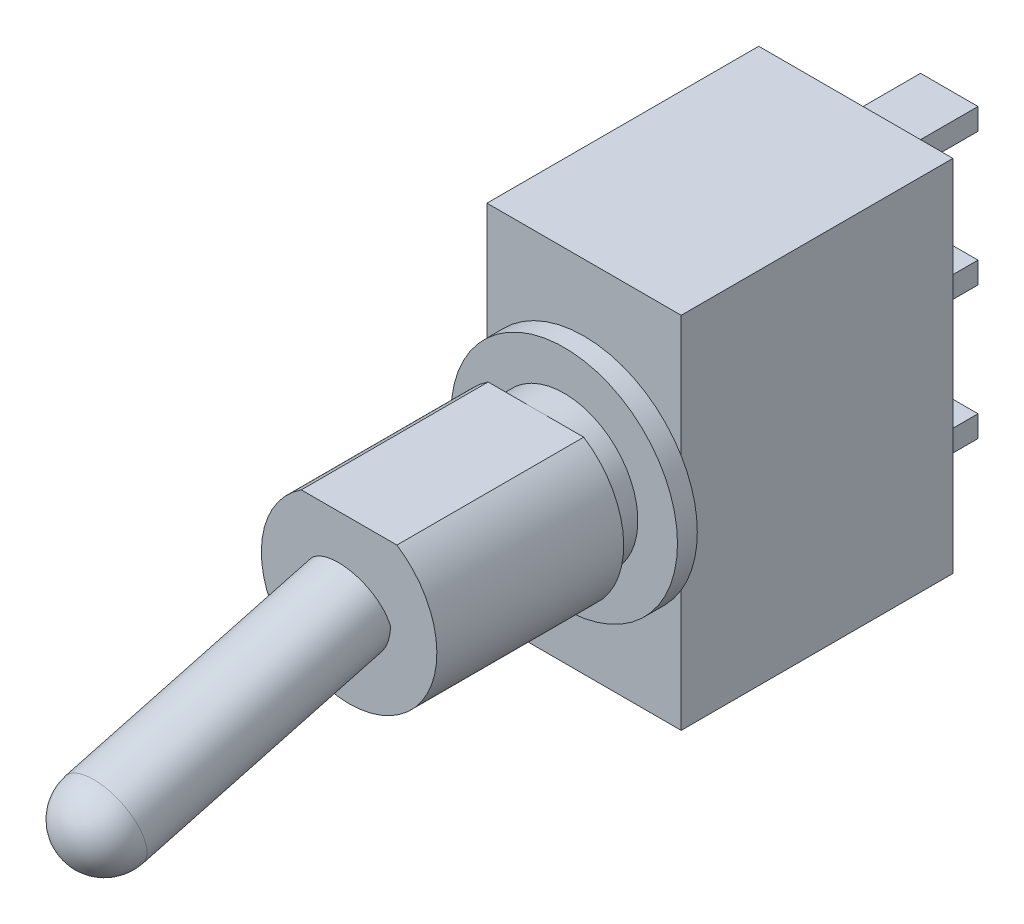
ISO-10303-21;
HEADER;
FILE_DESCRIPTION(('STEP AP214'),'2;1');
FILE_NAME('part.step','',(''),(''),'','','');
FILE_SCHEMA(('AUTOMOTIVE_DESIGN { 1 0 10303 214 1 1 1 1 }'));
ENDSEC;
DATA;
#1=APPLICATION_CONTEXT('core data for automotive mechanical design processes');
#2=APPLICATION_PROTOCOL_DEFINITION('international standard','automotive_design',2000,#1);
#3=PRODUCT_CONTEXT('',#1,'mechanical');
#4=PRODUCT('Part','Part','',(#3));
#5=PRODUCT_RELATED_PRODUCT_CATEGORY('part','',(#4));
#6=PRODUCT_DEFINITION_FORMATION('','',#4);
#7=PRODUCT_DEFINITION_CONTEXT('part definition',#1,'design');
#8=PRODUCT_DEFINITION('design','',#6,#7);
#9=PRODUCT_DEFINITION_SHAPE('','',#8);
#10=(LENGTH_UNIT() NAMED_UNIT(*) SI_UNIT(.MILLI.,.METRE.));
#11=(NAMED_UNIT(*) PLANE_ANGLE_UNIT() SI_UNIT($,.RADIAN.));
#12=(NAMED_UNIT(*) SI_UNIT($,.STERADIAN.) SOLID_ANGLE_UNIT());
#13=UNCERTAINTY_MEASURE_WITH_UNIT(LENGTH_MEASURE(1.E-05),#10,'distance_accuracy_value','');
#14=(GEOMETRIC_REPRESENTATION_CONTEXT(3) GLOBAL_UNCERTAINTY_ASSIGNED_CONTEXT((#13)) GLOBAL_UNIT_ASSIGNED_CONTEXT((#10,
#11,#12)) REPRESENTATION_CONTEXT('',''));
#15=CARTESIAN_POINT('',(0.,0.,0.));
#16=DIRECTION('',(0.,0.,1.));
#17=DIRECTION('',(1.,0.,0.));
#18=AXIS2_PLACEMENT_3D('',#15,#16,#17);
#19=CARTESIAN_POINT('',(0.,0.,9.6));
#20=DIRECTION('',(0.,0.,1.));
#21=DIRECTION('',(1.,0.,0.));
#22=AXIS2_PLACEMENT_3D('',#19,#20,#21);
#23=PLANE('',#22);
#24=DIRECTION('',(0.,-1.,0.));
#25=VECTOR('',#24,1.);
#26=CARTESIAN_POINT('',(-3.43,6.35,9.6));
#27=LINE('',#26,#25);
#28=CARTESIAN_POINT('',(-3.43,6.35,9.6));
#29=VERTEX_POINT('',#28);
#30=CARTESIAN_POINT('',(-3.43,2.05793585905878,9.6));
#31=VERTEX_POINT('',#30);
#32=EDGE_CURVE('E225',#29,#31,#27,.T.);
#33=ORIENTED_EDGE('',*,*,#32,.T.);
#34=CARTESIAN_POINT('',(0.,0.,9.6));
#35=DIRECTION('',(0.,0.,-1.));
#36=DIRECTION('',(-1.,0.,0.));
#37=AXIS2_PLACEMENT_3D('',#34,#35,#36);
#38=CIRCLE('',#37,4.);
#39=CARTESIAN_POINT('',(3.43,2.05793585905878,9.6));
#40=VERTEX_POINT('',#39);
#41=EDGE_CURVE('E212',#31,#40,#38,.T.);
#42=ORIENTED_EDGE('',*,*,#41,.T.);
#43=DIRECTION('',(0.,1.,0.));
#44=VECTOR('',#43,1.);
#45=CARTESIAN_POINT('',(3.43,6.35,9.6));
#46=LINE('',#45,#44);
#47=CARTESIAN_POINT('',(3.43,6.35,9.6));
#48=VERTEX_POINT('',#47);
#49=EDGE_CURVE('E222',#40,#48,#46,.T.);
#50=ORIENTED_EDGE('',*,*,#49,.T.);
#51=DIRECTION('',(-1.,0.,0.));
#52=VECTOR('',#51,1.);
#53=CARTESIAN_POINT('',(-3.43,6.35,9.6));
#54=LINE('',#53,#52);
#55=EDGE_CURVE('E220',#48,#29,#54,.T.);
#56=ORIENTED_EDGE('',*,*,#55,.T.);
#57=EDGE_LOOP('',(#33,#42,#50,#56));
#58=FACE_BOUND('',#57,.T.);
#59=ADVANCED_FACE('F34',(#58),#23,.T.);
#60=CARTESIAN_POINT('',(3.43,6.35,9.6));
#61=DIRECTION('',(-1.,0.,0.));
#62=DIRECTION('',(0.,-1.,0.));
#63=AXIS2_PLACEMENT_3D('',#60,#61,#62);
#64=PLANE('',#63);
#65=DIRECTION('',(0.,1.,0.));
#66=VECTOR('',#65,1.);
#67=CARTESIAN_POINT('',(3.43,6.35,0.));
#68=LINE('',#67,#66);
#69=CARTESIAN_POINT('',(3.43,-6.35,0.));
#70=VERTEX_POINT('',#69);
#71=CARTESIAN_POINT('',(3.43,6.35,0.));
#72=VERTEX_POINT('',#71);
#73=EDGE_CURVE('E211',#70,#72,#68,.T.);
#74=ORIENTED_EDGE('',*,*,#73,.T.);
#75=DIRECTION('',(0.,0.,-1.));
#76=VECTOR('',#75,1.);
#77=CARTESIAN_POINT('',(3.43,6.35,9.6));
#78=LINE('',#77,#76);
#79=EDGE_CURVE('E248',#48,#72,#78,.T.);
#80=ORIENTED_EDGE('',*,*,#79,.F.);
#81=ORIENTED_EDGE('',*,*,#49,.F.);
#82=CARTESIAN_POINT('',(3.43,-2.05793585905878,9.6));
#83=VERTEX_POINT('',#82);
#84=EDGE_CURVE('E221',#83,#40,#46,.T.);
#85=ORIENTED_EDGE('',*,*,#84,.F.);
#86=CARTESIAN_POINT('',(3.43,-6.35,9.6));
#87=VERTEX_POINT('',#86);
#88=EDGE_CURVE('E217',#87,#83,#46,.T.);
#89=ORIENTED_EDGE('',*,*,#88,.F.);
#90=DIRECTION('',(0.,0.,-1.));
#91=VECTOR('',#90,1.);
#92=CARTESIAN_POINT('',(3.43,-6.35,9.6));
#93=LINE('',#92,#91);
#94=EDGE_CURVE('E231',#87,#70,#93,.T.);
#95=ORIENTED_EDGE('',*,*,#94,.T.);
#96=EDGE_LOOP('',(#74,#80,#81,#85,#89,#95));
#97=FACE_BOUND('',#96,.T.);
#98=ADVANCED_FACE('F36',(#97),#64,.F.);
#99=CARTESIAN_POINT('',(-3.43,6.35,9.6));
#100=DIRECTION('',(0.,-1.,0.));
#101=DIRECTION('',(1.,0.,0.));
#102=AXIS2_PLACEMENT_3D('',#99,#100,#101);
#103=PLANE('',#102);
#104=DIRECTION('',(-1.,0.,0.));
#105=VECTOR('',#104,1.);
#106=CARTESIAN_POINT('',(-3.43,6.35,0.));
#107=LINE('',#106,#105);
#108=CARTESIAN_POINT('',(-3.43,6.35,0.));
#109=VERTEX_POINT('',#108);
#110=EDGE_CURVE('E234',#72,#109,#107,.T.);
#111=ORIENTED_EDGE('',*,*,#110,.T.);
#112=DIRECTION('',(0.,0.,-1.));
#113=VECTOR('',#112,1.);
#114=CARTESIAN_POINT('',(-3.43,6.35,9.6));
#115=LINE('',#114,#113);
#116=EDGE_CURVE('E245',#29,#109,#115,.T.);
#117=ORIENTED_EDGE('',*,*,#116,.F.);
#118=ORIENTED_EDGE('',*,*,#55,.F.);
#119=ORIENTED_EDGE('',*,*,#79,.T.);
#120=EDGE_LOOP('',(#111,#117,#118,#119));
#121=FACE_BOUND('',#120,.T.);
#122=ADVANCED_FACE('F400',(#121),#103,.F.);
#123=CARTESIAN_POINT('',(-3.43,6.35,9.6));
#124=DIRECTION('',(1.,0.,0.));
#125=DIRECTION('',(0.,1.,0.));
#126=AXIS2_PLACEMENT_3D('',#123,#124,#125);
#127=PLANE('',#126);
#128=DIRECTION('',(0.,-1.,0.));
#129=VECTOR('',#128,1.);
#130=CARTESIAN_POINT('',(-3.43,6.35,0.));
#131=LINE('',#130,#129);
#132=CARTESIAN_POINT('',(-3.43,-6.35,0.));
#133=VERTEX_POINT('',#132);
#134=EDGE_CURVE('E236',#109,#133,#131,.T.);
#135=ORIENTED_EDGE('',*,*,#134,.T.);
#136=DIRECTION('',(0.,0.,-1.));
#137=VECTOR('',#136,1.);
#138=CARTESIAN_POINT('',(-3.43,-6.35,9.6));
#139=LINE('',#138,#137);
#140=CARTESIAN_POINT('',(-3.43,-6.35,9.6));
#141=VERTEX_POINT('',#140);
#142=EDGE_CURVE('E242',#141,#133,#139,.T.);
#143=ORIENTED_EDGE('',*,*,#142,.F.);
#144=CARTESIAN_POINT('',(-3.43,-2.05793585905878,9.6));
#145=VERTEX_POINT('',#144);
#146=EDGE_CURVE('E224',#145,#141,#27,.T.);
#147=ORIENTED_EDGE('',*,*,#146,.F.);
#148=EDGE_CURVE('E229',#31,#145,#27,.T.);
#149=ORIENTED_EDGE('',*,*,#148,.F.);
#150=ORIENTED_EDGE('',*,*,#32,.F.);
#151=ORIENTED_EDGE('',*,*,#116,.T.);
#152=EDGE_LOOP('',(#135,#143,#147,#149,#150,#151));
#153=FACE_BOUND('',#152,.T.);
#154=ADVANCED_FACE('F392',(#153),#127,.F.);
#155=CARTESIAN_POINT('',(-3.43,-6.35,9.6));
#156=DIRECTION('',(0.,1.,0.));
#157=DIRECTION('',(-1.,0.,0.));
#158=AXIS2_PLACEMENT_3D('',#155,#156,#157);
#159=PLANE('',#158);
#160=DIRECTION('',(1.,0.,0.));
#161=VECTOR('',#160,1.);
#162=CARTESIAN_POINT('',(-3.43,-6.35,0.));
#163=LINE('',#162,#161);
#164=EDGE_CURVE('E238',#133,#70,#163,.T.);
#165=ORIENTED_EDGE('',*,*,#164,.T.);
#166=ORIENTED_EDGE('',*,*,#94,.F.);
#167=DIRECTION('',(1.,0.,0.));
#168=VECTOR('',#167,1.);
#169=CARTESIAN_POINT('',(-3.43,-6.35,9.6));
#170=LINE('',#169,#168);
#171=EDGE_CURVE('E228',#141,#87,#170,.T.);
#172=ORIENTED_EDGE('',*,*,#171,.F.);
#173=ORIENTED_EDGE('',*,*,#142,.T.);
#174=EDGE_LOOP('',(#165,#166,#172,#173));
#175=FACE_BOUND('',#174,.T.);
#176=ADVANCED_FACE('F408',(#175),#159,.F.);
#177=ORIENTED_EDGE('',*,*,#88,.T.);
#178=EDGE_CURVE('E216',#83,#145,#38,.T.);
#179=ORIENTED_EDGE('',*,*,#178,.T.);
#180=ORIENTED_EDGE('',*,*,#146,.T.);
#181=ORIENTED_EDGE('',*,*,#171,.T.);
#182=EDGE_LOOP('',(#177,#179,#180,#181));
#183=FACE_BOUND('',#182,.T.);
#184=ADVANCED_FACE('F414',(#183),#23,.T.);
#185=CARTESIAN_POINT('',(0.,0.,0.));
#186=DIRECTION('',(0.,0.,1.));
#187=DIRECTION('',(1.,0.,0.));
#188=AXIS2_PLACEMENT_3D('',#185,#186,#187);
#189=PLANE('',#188);
#190=DIRECTION('',(1.,0.,0.));
#191=VECTOR('',#190,1.);
#192=CARTESIAN_POINT('',(-1.015,-5.08,0.));
#193=LINE('',#192,#191);
#194=CARTESIAN_POINT('',(-1.015,-5.08,0.));
#195=VERTEX_POINT('',#194);
#196=CARTESIAN_POINT('',(1.015,-5.08,0.));
#197=VERTEX_POINT('',#196);
#198=EDGE_CURVE('E336',#195,#197,#193,.T.);
#199=ORIENTED_EDGE('',*,*,#198,.T.);
#200=DIRECTION('',(0.,1.,0.));
#201=VECTOR('',#200,1.);
#202=CARTESIAN_POINT('',(1.015,-4.32,0.));
#203=LINE('',#202,#201);
#204=CARTESIAN_POINT('',(1.015,-4.32,0.));
#205=VERTEX_POINT('',#204);
#206=EDGE_CURVE('E344',#197,#205,#203,.T.);
#207=ORIENTED_EDGE('',*,*,#206,.T.);
#208=DIRECTION('',(-1.,0.,0.));
#209=VECTOR('',#208,1.);
#210=CARTESIAN_POINT('',(-1.015,-4.32,0.));
#211=LINE('',#210,#209);
#212=CARTESIAN_POINT('',(-1.015,-4.32,0.));
#213=VERTEX_POINT('',#212);
#214=EDGE_CURVE('E341',#205,#213,#211,.T.);
#215=ORIENTED_EDGE('',*,*,#214,.T.);
#216=DIRECTION('',(0.,-1.,0.));
#217=VECTOR('',#216,1.);
#218=CARTESIAN_POINT('',(-1.015,-4.32,0.));
#219=LINE('',#218,#217);
#220=EDGE_CURVE('E56',#213,#195,#219,.T.);
#221=ORIENTED_EDGE('',*,*,#220,.T.);
#222=EDGE_LOOP('',(#199,#207,#215,#221));
#223=FACE_BOUND('',#222,.T.);
#224=DIRECTION('',(1.,0.,0.));
#225=VECTOR('',#224,1.);
#226=CARTESIAN_POINT('',(-1.015,4.32,0.));
#227=LINE('',#226,#225);
#228=CARTESIAN_POINT('',(-1.015,4.32,0.));
#229=VERTEX_POINT('',#228);
#230=CARTESIAN_POINT('',(1.015,4.32,0.));
#231=VERTEX_POINT('',#230);
#232=EDGE_CURVE('E304',#229,#231,#227,.T.);
#233=ORIENTED_EDGE('',*,*,#232,.T.);
#234=DIRECTION('',(0.,1.,0.));
#235=VECTOR('',#234,1.);
#236=CARTESIAN_POINT('',(1.015,5.08,0.));
#237=LINE('',#236,#235);
#238=CARTESIAN_POINT('',(1.015,5.08,0.));
#239=VERTEX_POINT('',#238);
#240=EDGE_CURVE('E314',#231,#239,#237,.T.);
#241=ORIENTED_EDGE('',*,*,#240,.T.);
#242=DIRECTION('',(-1.,0.,0.));
#243=VECTOR('',#242,1.);
#244=CARTESIAN_POINT('',(-1.015,5.08,0.));
#245=LINE('',#244,#243);
#246=CARTESIAN_POINT('',(-1.015,5.08,0.));
#247=VERTEX_POINT('',#246);
#248=EDGE_CURVE('E311',#239,#247,#245,.T.);
#249=ORIENTED_EDGE('',*,*,#248,.T.);
#250=DIRECTION('',(0.,-1.,0.));
#251=VECTOR('',#250,1.);
#252=CARTESIAN_POINT('',(-1.015,5.08,0.));
#253=LINE('',#252,#251);
#254=EDGE_CURVE('E308',#247,#229,#253,.T.);
#255=ORIENTED_EDGE('',*,*,#254,.T.);
#256=EDGE_LOOP('',(#233,#241,#249,#255));
#257=FACE_BOUND('',#256,.T.);
#258=DIRECTION('',(1.,0.,0.));
#259=VECTOR('',#258,1.);
#260=CARTESIAN_POINT('',(-1.015,-0.38,0.));
#261=LINE('',#260,#259);
#262=CARTESIAN_POINT('',(-1.015,-0.38,0.));
#263=VERTEX_POINT('',#262);
#264=CARTESIAN_POINT('',(1.015,-0.38,0.));
#265=VERTEX_POINT('',#264);
#266=EDGE_CURVE('E271',#263,#265,#261,.T.);
#267=ORIENTED_EDGE('',*,*,#266,.T.);
#268=DIRECTION('',(0.,1.,0.));
#269=VECTOR('',#268,1.);
#270=CARTESIAN_POINT('',(1.015,0.38,0.));
#271=LINE('',#270,#269);
#272=CARTESIAN_POINT('',(1.015,0.38,0.));
#273=VERTEX_POINT('',#272);
#274=EDGE_CURVE('E281',#265,#273,#271,.T.);
#275=ORIENTED_EDGE('',*,*,#274,.T.);
#276=DIRECTION('',(-1.,0.,0.));
#277=VECTOR('',#276,1.);
#278=CARTESIAN_POINT('',(-1.015,0.38,0.));
#279=LINE('',#278,#277);
#280=CARTESIAN_POINT('',(-1.015,0.38,0.));
#281=VERTEX_POINT('',#280);
#282=EDGE_CURVE('E278',#273,#281,#279,.T.);
#283=ORIENTED_EDGE('',*,*,#282,.T.);
#284=DIRECTION('',(0.,-1.,0.));
#285=VECTOR('',#284,1.);
#286=CARTESIAN_POINT('',(-1.015,0.38,0.));
#287=LINE('',#286,#285);
#288=EDGE_CURVE('E275',#281,#263,#287,.T.);
#289=ORIENTED_EDGE('',*,*,#288,.T.);
#290=EDGE_LOOP('',(#267,#275,#283,#289));
#291=FACE_BOUND('',#290,.T.);
#292=ORIENTED_EDGE('',*,*,#73,.F.);
#293=ORIENTED_EDGE('',*,*,#164,.F.);
#294=ORIENTED_EDGE('',*,*,#134,.F.);
#295=ORIENTED_EDGE('',*,*,#110,.F.);
#296=EDGE_LOOP('',(#292,#293,#294,#295));
#297=FACE_BOUND('',#296,.T.);
#298=ADVANCED_FACE('F405',(#223,#257,#291,#297),#189,.F.);
#299=CARTESIAN_POINT('',(0.,0.,9.6));
#300=DIRECTION('',(0.,0.,-1.));
#301=DIRECTION('',(-1.,0.,0.));
#302=AXIS2_PLACEMENT_3D('',#299,#300,#301);
#303=PLANE('',#302);
#304=EDGE_CURVE('E215',#40,#83,#38,.T.);
#305=ORIENTED_EDGE('',*,*,#304,.T.);
#306=ORIENTED_EDGE('',*,*,#84,.T.);
#307=EDGE_LOOP('',(#305,#306));
#308=FACE_BOUND('',#307,.T.);
#309=ADVANCED_FACE('F380',(#308),#303,.T.);
#310=CARTESIAN_POINT('',(0.,0.,10.3));
#311=DIRECTION('',(0.,0.,-1.));
#312=DIRECTION('',(-1.,0.,0.));
#313=AXIS2_PLACEMENT_3D('',#310,#311,#312);
#314=CYLINDRICAL_SURFACE('',#313,4.);
#315=CARTESIAN_POINT('',(0.,0.,10.3));
#316=DIRECTION('',(0.,0.,-1.));
#317=DIRECTION('',(-1.,0.,0.));
#318=AXIS2_PLACEMENT_3D('',#315,#316,#317);
#319=CIRCLE('',#318,4.);
#320=CARTESIAN_POINT('',(-4.,0.,10.3));
#321=VERTEX_POINT('',#320);
#322=EDGE_CURVE('E208',#321,#321,#319,.T.);
#323=ORIENTED_EDGE('',*,*,#322,.T.);
#324=EDGE_LOOP('',(#323));
#325=FACE_BOUND('',#324,.T.);
#326=ORIENTED_EDGE('',*,*,#41,.F.);
#327=EDGE_CURVE('E207',#145,#31,#38,.T.);
#328=ORIENTED_EDGE('',*,*,#327,.F.);
#329=ORIENTED_EDGE('',*,*,#178,.F.);
#330=ORIENTED_EDGE('',*,*,#304,.F.);
#331=EDGE_LOOP('',(#326,#328,#329,#330));
#332=FACE_BOUND('',#331,.T.);
#333=ADVANCED_FACE('F374',(#325,#332),#314,.T.);
#334=CARTESIAN_POINT('',(0.,0.,10.3));
#335=DIRECTION('',(0.,0.,-1.));
#336=DIRECTION('',(-1.,0.,0.));
#337=AXIS2_PLACEMENT_3D('',#334,#335,#336);
#338=PLANE('',#337);
#339=CARTESIAN_POINT('',(0.,0.,10.3));
#340=DIRECTION('',(0.,0.,-1.));
#341=DIRECTION('',(-1.,0.,0.));
#342=AXIS2_PLACEMENT_3D('',#339,#340,#341);
#343=CIRCLE('',#342,2.6);
#344=CARTESIAN_POINT('',(-2.6,0.,10.3));
#345=VERTEX_POINT('',#344);
#346=EDGE_CURVE('E204',#345,#345,#343,.T.);
#347=ORIENTED_EDGE('',*,*,#346,.T.);
#348=EDGE_LOOP('',(#347));
#349=FACE_BOUND('',#348,.T.);
#350=ORIENTED_EDGE('',*,*,#322,.F.);
#351=EDGE_LOOP('',(#350));
#352=FACE_BOUND('',#351,.T.);
#353=ADVANCED_FACE('F371',(#349,#352),#338,.F.);
#354=ORIENTED_EDGE('',*,*,#327,.T.);
#355=ORIENTED_EDGE('',*,*,#148,.T.);
#356=EDGE_LOOP('',(#354,#355));
#357=FACE_BOUND('',#356,.T.);
#358=ADVANCED_FACE('F367',(#357),#303,.T.);
#359=CARTESIAN_POINT('',(0.,0.,0.));
#360=DIRECTION('',(0.,0.,-1.));
#361=DIRECTION('',(-1.,0.,0.));
#362=AXIS2_PLACEMENT_3D('',#359,#360,#361);
#363=CYLINDRICAL_SURFACE('',#362,2.6);
#364=CARTESIAN_POINT('',(0.,0.,11.3));
#365=DIRECTION('',(0.,0.,-1.));
#366=DIRECTION('',(-1.,0.,0.));
#367=AXIS2_PLACEMENT_3D('',#364,#365,#366);
#368=CIRCLE('',#367,2.6);
#369=CARTESIAN_POINT('',(0.,2.6,11.3));
#370=VERTEX_POINT('',#369);
#371=EDGE_CURVE('E195',#370,#370,#368,.T.);
#372=ORIENTED_EDGE('',*,*,#371,.T.);
#373=EDGE_LOOP('',(#372));
#374=FACE_BOUND('',#373,.T.);
#375=ORIENTED_EDGE('',*,*,#346,.F.);
#376=EDGE_LOOP('',(#375));
#377=FACE_BOUND('',#376,.T.);
#378=ADVANCED_FACE('F364',(#374,#377),#363,.T.);
#379=CARTESIAN_POINT('',(0.,2.6,11.3));
#380=DIRECTION('',(0.,0.,-1.));
#381=DIRECTION('',(-1.,0.,0.));
#382=AXIS2_PLACEMENT_3D('',#379,#380,#381);
#383=PLANE('',#382);
#384=DIRECTION('',(-1.,0.,0.));
#385=VECTOR('',#384,1.);
#386=CARTESIAN_POINT('',(0.,2.6,11.3));
#387=LINE('',#386,#385);
#388=CARTESIAN_POINT('',(1.68819430161341,2.6,11.3));
#389=VERTEX_POINT('',#388);
#390=EDGE_CURVE('E189',#389,#370,#387,.T.);
#391=ORIENTED_EDGE('',*,*,#390,.F.);
#392=CARTESIAN_POINT('',(0.,0.,11.3));
#393=DIRECTION('',(0.,0.,-1.));
#394=DIRECTION('',(-1.,0.,0.));
#395=AXIS2_PLACEMENT_3D('',#392,#393,#394);
#396=CIRCLE('',#395,3.1);
#397=CARTESIAN_POINT('',(-1.68819430161341,2.6,11.3));
#398=VERTEX_POINT('',#397);
#399=EDGE_CURVE('E188',#389,#398,#396,.T.);
#400=ORIENTED_EDGE('',*,*,#399,.T.);
#401=EDGE_CURVE('E347',#370,#398,#387,.T.);
#402=ORIENTED_EDGE('',*,*,#401,.F.);
#403=ORIENTED_EDGE('',*,*,#371,.F.);
#404=EDGE_LOOP('',(#391,#400,#402,#403));
#405=FACE_BOUND('',#404,.T.);
#406=ADVANCED_FACE('F362',(#405),#383,.T.);
#407=CARTESIAN_POINT('',(0.,0.,0.));
#408=DIRECTION('',(0.,0.,-1.));
#409=DIRECTION('',(-1.,0.,0.));
#410=AXIS2_PLACEMENT_3D('',#407,#408,#409);
#411=CYLINDRICAL_SURFACE('',#410,3.1);
#412=DIRECTION('',(0.,0.,-1.));
#413=VECTOR('',#412,1.);
#414=CARTESIAN_POINT('',(-1.68819430161341,2.6,0.));
#415=LINE('',#414,#413);
#416=CARTESIAN_POINT('',(-1.68819430161341,2.6,17.9));
#417=VERTEX_POINT('',#416);
#418=EDGE_CURVE('E48',#398,#417,#415,.F.);
#419=ORIENTED_EDGE('',*,*,#418,.F.);
#420=ORIENTED_EDGE('',*,*,#399,.F.);
#421=DIRECTION('',(0.,0.,-1.));
#422=VECTOR('',#421,1.);
#423=CARTESIAN_POINT('',(1.68819430161341,2.6,0.));
#424=LINE('',#423,#422);
#425=CARTESIAN_POINT('',(1.68819430161341,2.6,17.9));
#426=VERTEX_POINT('',#425);
#427=EDGE_CURVE('E178',#426,#389,#424,.T.);
#428=ORIENTED_EDGE('',*,*,#427,.F.);
#429=CARTESIAN_POINT('',(0.,0.,17.9));
#430=DIRECTION('',(0.,0.,-1.));
#431=DIRECTION('',(-1.,0.,0.));
#432=AXIS2_PLACEMENT_3D('',#429,#430,#431);
#433=CIRCLE('',#432,3.1);
#434=EDGE_CURVE('E186',#426,#417,#433,.T.);
#435=ORIENTED_EDGE('',*,*,#434,.T.);
#436=EDGE_LOOP('',(#419,#420,#428,#435));
#437=FACE_BOUND('',#436,.T.);
#438=ADVANCED_FACE('F185',(#437),#411,.T.);
#439=CARTESIAN_POINT('',(0.,3.1,17.9));
#440=DIRECTION('',(0.,0.,1.));
#441=DIRECTION('',(1.,0.,0.));
#442=AXIS2_PLACEMENT_3D('',#439,#440,#441);
#443=PLANE('',#442);
#444=DIRECTION('',(1.,0.,0.));
#445=VECTOR('',#444,1.);
#446=CARTESIAN_POINT('',(0.,2.6,17.9));
#447=LINE('',#446,#445);
#448=EDGE_CURVE('E11',#417,#426,#447,.T.);
#449=ORIENTED_EDGE('',*,*,#448,.F.);
#450=ORIENTED_EDGE('',*,*,#434,.F.);
#451=EDGE_LOOP('',(#449,#450));
#452=FACE_BOUND('',#451,.T.);
#453=DIRECTION('',(-1.,0.,0.));
#454=VECTOR('',#453,1.);
#455=CARTESIAN_POINT('',(0.,0.,17.9));
#456=LINE('',#455,#454);
#457=CARTESIAN_POINT('',(1.46,0.,17.9));
#458=VERTEX_POINT('',#457);
#459=CARTESIAN_POINT('',(-1.46,0.,17.9));
#460=VERTEX_POINT('',#459);
#461=EDGE_CURVE('E42',#458,#460,#456,.T.);
#462=ORIENTED_EDGE('',*,*,#461,.F.);
#463=CARTESIAN_POINT('',(0.,0.,17.9));
#464=DIRECTION('',(0.,0.,1.));
#465=DIRECTION('',(0.,1.,0.));
#466=AXIS2_PLACEMENT_3D('',#463,#464,#465);
#467=ELLIPSE('',#466,1.51150322339872,1.46);
#468=EDGE_CURVE('E251',#460,#458,#467,.T.);
#469=ORIENTED_EDGE('',*,*,#468,.F.);
#470=EDGE_LOOP('',(#462,#469));
#471=FACE_BOUND('',#470,.T.);
#472=ADVANCED_FACE('F191',(#452,#471),#443,.T.);
#473=CARTESIAN_POINT('',(0.,1.41025170638204,18.2778758058497));
#474=DIRECTION('',(0.,0.258819045102522,-0.965925826289068));
#475=DIRECTION('',(0.,0.965925826289068,0.258819045102522));
#476=AXIS2_PLACEMENT_3D('',#473,#474,#475);
#477=PLANE('',#476);
#478=CARTESIAN_POINT('',(0.,0.,17.9));
#479=DIRECTION('',(0.,0.258819045102522,-0.965925826289068));
#480=DIRECTION('',(0.,0.965925826289068,0.258819045102522));
#481=AXIS2_PLACEMENT_3D('',#478,#479,#480);
#482=CIRCLE('',#481,1.46);
#483=EDGE_CURVE('E198',#460,#458,#482,.T.);
#484=ORIENTED_EDGE('',*,*,#483,.T.);
#485=ORIENTED_EDGE('',*,*,#461,.T.);
#486=EDGE_LOOP('',(#484,#485));
#487=FACE_BOUND('',#486,.T.);
#488=ADVANCED_FACE('F257',(#487),#477,.T.);
#489=CARTESIAN_POINT('',(0.,-2.31643045366757,26.5450361452871));
#490=DIRECTION('',(0.,0.258819045102522,-0.965925826289068));
#491=DIRECTION('',(0.,0.965925826289068,0.258819045102522));
#492=AXIS2_PLACEMENT_3D('',#489,#490,#491);
#493=SPHERICAL_SURFACE('',#492,1.46000000000001);
#494=CARTESIAN_POINT('',(0.,-2.31643045366757,26.5450361452871));
#495=DIRECTION('',(0.,0.258819045102522,-0.965925826289068));
#496=DIRECTION('',(0.,0.965925826289068,0.258819045102522));
#497=AXIS2_PLACEMENT_3D('',#494,#495,#496);
#498=CIRCLE('',#497,1.46);
#499=CARTESIAN_POINT('',(0.,-0.906178747285528,26.9229119511368));
#500=VERTEX_POINT('',#499);
#501=EDGE_CURVE('E193',#500,#500,#498,.T.);
#502=ORIENTED_EDGE('',*,*,#501,.F.);
#503=EDGE_LOOP('',(#502));
#504=FACE_BOUND('',#503,.T.);
#505=ADVANCED_FACE('F481',(#504),#493,.T.);
#506=CARTESIAN_POINT('',(0.,0.,17.9));
#507=DIRECTION('',(0.,0.258819045102522,-0.965925826289068));
#508=DIRECTION('',(0.,0.965925826289068,0.258819045102522));
#509=AXIS2_PLACEMENT_3D('',#506,#507,#508);
#510=CYLINDRICAL_SURFACE('',#509,1.46);
#511=ORIENTED_EDGE('',*,*,#501,.T.);
#512=EDGE_LOOP('',(#511));
#513=FACE_BOUND('',#512,.T.);
#514=ORIENTED_EDGE('',*,*,#483,.F.);
#515=ORIENTED_EDGE('',*,*,#468,.T.);
#516=EDGE_LOOP('',(#514,#515));
#517=FACE_BOUND('',#516,.T.);
#518=ADVANCED_FACE('F259',(#513,#517),#510,.T.);
#519=CARTESIAN_POINT('',(1.015,0.38,-3.3));
#520=DIRECTION('',(1.,0.,0.));
#521=DIRECTION('',(0.,0.,-1.));
#522=AXIS2_PLACEMENT_3D('',#519,#520,#521);
#523=PLANE('',#522);
#524=ORIENTED_EDGE('',*,*,#274,.F.);
#525=DIRECTION('',(0.,0.,1.));
#526=VECTOR('',#525,1.);
#527=CARTESIAN_POINT('',(1.015,-0.38,-3.3));
#528=LINE('',#527,#526);
#529=CARTESIAN_POINT('',(1.015,-0.38,-3.3));
#530=VERTEX_POINT('',#529);
#531=EDGE_CURVE('E260',#530,#265,#528,.T.);
#532=ORIENTED_EDGE('',*,*,#531,.F.);
#533=DIRECTION('',(0.,1.,0.));
#534=VECTOR('',#533,1.);
#535=CARTESIAN_POINT('',(1.015,0.38,-3.3));
#536=LINE('',#535,#534);
#537=CARTESIAN_POINT('',(1.015,0.38,-3.3));
#538=VERTEX_POINT('',#537);
#539=EDGE_CURVE('E274',#530,#538,#536,.T.);
#540=ORIENTED_EDGE('',*,*,#539,.T.);
#541=DIRECTION('',(0.,0.,1.));
#542=VECTOR('',#541,1.);
#543=CARTESIAN_POINT('',(1.015,0.38,-3.3));
#544=LINE('',#543,#542);
#545=EDGE_CURVE('E264',#538,#273,#544,.T.);
#546=ORIENTED_EDGE('',*,*,#545,.T.);
#547=EDGE_LOOP('',(#524,#532,#540,#546));
#548=FACE_BOUND('',#547,.T.);
#549=ADVANCED_FACE('F501',(#548),#523,.T.);
#550=CARTESIAN_POINT('',(-1.015,-0.38,-3.3));
#551=DIRECTION('',(0.,-1.,0.));
#552=DIRECTION('',(1.,0.,0.));
#553=AXIS2_PLACEMENT_3D('',#550,#551,#552);
#554=PLANE('',#553);
#555=ORIENTED_EDGE('',*,*,#266,.F.);
#556=DIRECTION('',(0.,0.,1.));
#557=VECTOR('',#556,1.);
#558=CARTESIAN_POINT('',(-1.015,-0.38,-3.3));
#559=LINE('',#558,#557);
#560=CARTESIAN_POINT('',(-1.015,-0.38,-3.3));
#561=VERTEX_POINT('',#560);
#562=EDGE_CURVE('E261',#561,#263,#559,.T.);
#563=ORIENTED_EDGE('',*,*,#562,.F.);
#564=DIRECTION('',(1.,0.,0.));
#565=VECTOR('',#564,1.);
#566=CARTESIAN_POINT('',(-1.015,-0.38,-3.3));
#567=LINE('',#566,#565);
#568=EDGE_CURVE('E267',#561,#530,#567,.T.);
#569=ORIENTED_EDGE('',*,*,#568,.T.);
#570=ORIENTED_EDGE('',*,*,#531,.T.);
#571=EDGE_LOOP('',(#555,#563,#569,#570));
#572=FACE_BOUND('',#571,.T.);
#573=ADVANCED_FACE('F516',(#572),#554,.T.);
#574=CARTESIAN_POINT('',(-1.015,0.38,-3.3));
#575=DIRECTION('',(-1.,0.,0.));
#576=DIRECTION('',(0.,-1.,0.));
#577=AXIS2_PLACEMENT_3D('',#574,#575,#576);
#578=PLANE('',#577);
#579=ORIENTED_EDGE('',*,*,#288,.F.);
#580=DIRECTION('',(0.,0.,1.));
#581=VECTOR('',#580,1.);
#582=CARTESIAN_POINT('',(-1.015,0.38,-3.3));
#583=LINE('',#582,#581);
#584=CARTESIAN_POINT('',(-1.015,0.38,-3.3));
#585=VERTEX_POINT('',#584);
#586=EDGE_CURVE('E266',#585,#281,#583,.T.);
#587=ORIENTED_EDGE('',*,*,#586,.F.);
#588=DIRECTION('',(0.,-1.,0.));
#589=VECTOR('',#588,1.);
#590=CARTESIAN_POINT('',(-1.015,0.38,-3.3));
#591=LINE('',#590,#589);
#592=EDGE_CURVE('E287',#585,#561,#591,.T.);
#593=ORIENTED_EDGE('',*,*,#592,.T.);
#594=ORIENTED_EDGE('',*,*,#562,.T.);
#595=EDGE_LOOP('',(#579,#587,#593,#594));
#596=FACE_BOUND('',#595,.T.);
#597=ADVANCED_FACE('F526',(#596),#578,.T.);
#598=CARTESIAN_POINT('',(-1.015,0.38,-3.3));
#599=DIRECTION('',(0.,1.,0.));
#600=DIRECTION('',(0.,0.,1.));
#601=AXIS2_PLACEMENT_3D('',#598,#599,#600);
#602=PLANE('',#601);
#603=ORIENTED_EDGE('',*,*,#282,.F.);
#604=ORIENTED_EDGE('',*,*,#545,.F.);
#605=DIRECTION('',(-1.,0.,0.));
#606=VECTOR('',#605,1.);
#607=CARTESIAN_POINT('',(-1.015,0.38,-3.3));
#608=LINE('',#607,#606);
#609=EDGE_CURVE('E290',#538,#585,#608,.T.);
#610=ORIENTED_EDGE('',*,*,#609,.T.);
#611=ORIENTED_EDGE('',*,*,#586,.T.);
#612=EDGE_LOOP('',(#603,#604,#610,#611));
#613=FACE_BOUND('',#612,.T.);
#614=ADVANCED_FACE('F536',(#613),#602,.T.);
#615=CARTESIAN_POINT('',(0.,0.,-3.3));
#616=DIRECTION('',(0.,0.,1.));
#617=DIRECTION('',(1.,0.,0.));
#618=AXIS2_PLACEMENT_3D('',#615,#616,#617);
#619=PLANE('',#618);
#620=ORIENTED_EDGE('',*,*,#539,.F.);
#621=ORIENTED_EDGE('',*,*,#568,.F.);
#622=ORIENTED_EDGE('',*,*,#592,.F.);
#623=ORIENTED_EDGE('',*,*,#609,.F.);
#624=EDGE_LOOP('',(#620,#621,#622,#623));
#625=FACE_BOUND('',#624,.T.);
#626=ADVANCED_FACE('F546',(#625),#619,.F.);
#627=CARTESIAN_POINT('',(1.015,5.08,-3.3));
#628=DIRECTION('',(1.,0.,0.));
#629=DIRECTION('',(0.,0.,-1.));
#630=AXIS2_PLACEMENT_3D('',#627,#628,#629);
#631=PLANE('',#630);
#632=ORIENTED_EDGE('',*,*,#240,.F.);
#633=DIRECTION('',(0.,0.,1.));
#634=VECTOR('',#633,1.);
#635=CARTESIAN_POINT('',(1.015,4.32,-3.3));
#636=LINE('',#635,#634);
#637=CARTESIAN_POINT('',(1.015,4.32,-3.3));
#638=VERTEX_POINT('',#637);
#639=EDGE_CURVE('E284',#638,#231,#636,.T.);
#640=ORIENTED_EDGE('',*,*,#639,.F.);
#641=DIRECTION('',(0.,1.,0.));
#642=VECTOR('',#641,1.);
#643=CARTESIAN_POINT('',(1.015,5.08,-3.3));
#644=LINE('',#643,#642);
#645=CARTESIAN_POINT('',(1.015,5.08,-3.3));
#646=VERTEX_POINT('',#645);
#647=EDGE_CURVE('E307',#638,#646,#644,.T.);
#648=ORIENTED_EDGE('',*,*,#647,.T.);
#649=DIRECTION('',(0.,0.,1.));
#650=VECTOR('',#649,1.);
#651=CARTESIAN_POINT('',(1.015,5.08,-3.3));
#652=LINE('',#651,#650);
#653=EDGE_CURVE('E295',#646,#239,#652,.T.);
#654=ORIENTED_EDGE('',*,*,#653,.T.);
#655=EDGE_LOOP('',(#632,#640,#648,#654));
#656=FACE_BOUND('',#655,.T.);
#657=ADVANCED_FACE('F556',(#656),#631,.T.);
#658=CARTESIAN_POINT('',(-1.015,4.32,-3.3));
#659=DIRECTION('',(0.,-1.,0.));
#660=DIRECTION('',(0.,0.,-1.));
#661=AXIS2_PLACEMENT_3D('',#658,#659,#660);
#662=PLANE('',#661);
#663=ORIENTED_EDGE('',*,*,#232,.F.);
#664=DIRECTION('',(0.,0.,1.));
#665=VECTOR('',#664,1.);
#666=CARTESIAN_POINT('',(-1.015,4.32,-3.3));
#667=LINE('',#666,#665);
#668=CARTESIAN_POINT('',(-1.015,4.32,-3.3));
#669=VERTEX_POINT('',#668);
#670=EDGE_CURVE('E301',#669,#229,#667,.T.);
#671=ORIENTED_EDGE('',*,*,#670,.F.);
#672=DIRECTION('',(1.,0.,0.));
#673=VECTOR('',#672,1.);
#674=CARTESIAN_POINT('',(-1.015,4.32,-3.3));
#675=LINE('',#674,#673);
#676=EDGE_CURVE('E298',#669,#638,#675,.T.);
#677=ORIENTED_EDGE('',*,*,#676,.T.);
#678=ORIENTED_EDGE('',*,*,#639,.T.);
#679=EDGE_LOOP('',(#663,#671,#677,#678));
#680=FACE_BOUND('',#679,.T.);
#681=ADVANCED_FACE('F566',(#680),#662,.T.);
#682=CARTESIAN_POINT('',(-1.015,5.08,-3.3));
#683=DIRECTION('',(-1.,0.,0.));
#684=DIRECTION('',(0.,0.,1.));
#685=AXIS2_PLACEMENT_3D('',#682,#683,#684);
#686=PLANE('',#685);
#687=ORIENTED_EDGE('',*,*,#254,.F.);
#688=DIRECTION('',(0.,0.,1.));
#689=VECTOR('',#688,1.);
#690=CARTESIAN_POINT('',(-1.015,5.08,-3.3));
#691=LINE('',#690,#689);
#692=CARTESIAN_POINT('',(-1.015,5.08,-3.3));
#693=VERTEX_POINT('',#692);
#694=EDGE_CURVE('E297',#693,#247,#691,.T.);
#695=ORIENTED_EDGE('',*,*,#694,.F.);
#696=DIRECTION('',(0.,-1.,0.));
#697=VECTOR('',#696,1.);
#698=CARTESIAN_POINT('',(-1.015,5.08,-3.3));
#699=LINE('',#698,#697);
#700=EDGE_CURVE('E320',#693,#669,#699,.T.);
#701=ORIENTED_EDGE('',*,*,#700,.T.);
#702=ORIENTED_EDGE('',*,*,#670,.T.);
#703=EDGE_LOOP('',(#687,#695,#701,#702));
#704=FACE_BOUND('',#703,.T.);
#705=ADVANCED_FACE('F576',(#704),#686,.T.);
#706=CARTESIAN_POINT('',(-1.015,5.08,-3.3));
#707=DIRECTION('',(0.,1.,0.));
#708=DIRECTION('',(0.,0.,1.));
#709=AXIS2_PLACEMENT_3D('',#706,#707,#708);
#710=PLANE('',#709);
#711=ORIENTED_EDGE('',*,*,#248,.F.);
#712=ORIENTED_EDGE('',*,*,#653,.F.);
#713=DIRECTION('',(-1.,0.,0.));
#714=VECTOR('',#713,1.);
#715=CARTESIAN_POINT('',(-1.015,5.08,-3.3));
#716=LINE('',#715,#714);
#717=EDGE_CURVE('E323',#646,#693,#716,.T.);
#718=ORIENTED_EDGE('',*,*,#717,.T.);
#719=ORIENTED_EDGE('',*,*,#694,.T.);
#720=EDGE_LOOP('',(#711,#712,#718,#719));
#721=FACE_BOUND('',#720,.T.);
#722=ADVANCED_FACE('F586',(#721),#710,.T.);
#723=CARTESIAN_POINT('',(0.,0.,-3.3));
#724=DIRECTION('',(0.,0.,1.));
#725=DIRECTION('',(1.,0.,0.));
#726=AXIS2_PLACEMENT_3D('',#723,#724,#725);
#727=PLANE('',#726);
#728=ORIENTED_EDGE('',*,*,#647,.F.);
#729=ORIENTED_EDGE('',*,*,#676,.F.);
#730=ORIENTED_EDGE('',*,*,#700,.F.);
#731=ORIENTED_EDGE('',*,*,#717,.F.);
#732=EDGE_LOOP('',(#728,#729,#730,#731));
#733=FACE_BOUND('',#732,.T.);
#734=ADVANCED_FACE('F596',(#733),#727,.F.);
#735=CARTESIAN_POINT('',(1.015,-4.32,-3.3));
#736=DIRECTION('',(1.,0.,0.));
#737=DIRECTION('',(0.,1.,0.));
#738=AXIS2_PLACEMENT_3D('',#735,#736,#737);
#739=PLANE('',#738);
#740=ORIENTED_EDGE('',*,*,#206,.F.);
#741=DIRECTION('',(0.,0.,1.));
#742=VECTOR('',#741,1.);
#743=CARTESIAN_POINT('',(1.015,-5.08,-3.3));
#744=LINE('',#743,#742);
#745=CARTESIAN_POINT('',(1.015,-5.08,-3.3));
#746=VERTEX_POINT('',#745);
#747=EDGE_CURVE('E317',#746,#197,#744,.T.);
#748=ORIENTED_EDGE('',*,*,#747,.F.);
#749=DIRECTION('',(0.,1.,0.));
#750=VECTOR('',#749,1.);
#751=CARTESIAN_POINT('',(1.015,-4.32,-3.3));
#752=LINE('',#751,#750);
#753=CARTESIAN_POINT('',(1.015,-4.32,-3.3));
#754=VERTEX_POINT('',#753);
#755=EDGE_CURVE('E339',#746,#754,#752,.T.);
#756=ORIENTED_EDGE('',*,*,#755,.T.);
#757=DIRECTION('',(0.,0.,1.));
#758=VECTOR('',#757,1.);
#759=CARTESIAN_POINT('',(1.015,-4.32,-3.3));
#760=LINE('',#759,#758);
#761=EDGE_CURVE('E328',#754,#205,#760,.T.);
#762=ORIENTED_EDGE('',*,*,#761,.T.);
#763=EDGE_LOOP('',(#740,#748,#756,#762));
#764=FACE_BOUND('',#763,.T.);
#765=ADVANCED_FACE('F606',(#764),#739,.T.);
#766=CARTESIAN_POINT('',(-1.015,-5.08,-3.3));
#767=DIRECTION('',(0.,-1.,0.));
#768=DIRECTION('',(0.,0.,-1.));
#769=AXIS2_PLACEMENT_3D('',#766,#767,#768);
#770=PLANE('',#769);
#771=ORIENTED_EDGE('',*,*,#198,.F.);
#772=DIRECTION('',(0.,0.,1.));
#773=VECTOR('',#772,1.);
#774=CARTESIAN_POINT('',(-1.015,-5.08,-3.3));
#775=LINE('',#774,#773);
#776=CARTESIAN_POINT('',(-1.015,-5.08,-3.3));
#777=VERTEX_POINT('',#776);
#778=EDGE_CURVE('E333',#777,#195,#775,.T.);
#779=ORIENTED_EDGE('',*,*,#778,.F.);
#780=DIRECTION('',(1.,0.,0.));
#781=VECTOR('',#780,1.);
#782=CARTESIAN_POINT('',(-1.015,-5.08,-3.3));
#783=LINE('',#782,#781);
#784=EDGE_CURVE('E331',#777,#746,#783,.T.);
#785=ORIENTED_EDGE('',*,*,#784,.T.);
#786=ORIENTED_EDGE('',*,*,#747,.T.);
#787=EDGE_LOOP('',(#771,#779,#785,#786));
#788=FACE_BOUND('',#787,.T.);
#789=ADVANCED_FACE('F616',(#788),#770,.T.);
#790=CARTESIAN_POINT('',(-1.015,-4.32,-3.3));
#791=DIRECTION('',(-1.,0.,0.));
#792=DIRECTION('',(0.,-1.,0.));
#793=AXIS2_PLACEMENT_3D('',#790,#791,#792);
#794=PLANE('',#793);
#795=ORIENTED_EDGE('',*,*,#220,.F.);
#796=DIRECTION('',(0.,0.,1.));
#797=VECTOR('',#796,1.);
#798=CARTESIAN_POINT('',(-1.015,-4.32,-3.3));
#799=LINE('',#798,#797);
#800=CARTESIAN_POINT('',(-1.015,-4.32,-3.3));
#801=VERTEX_POINT('',#800);
#802=EDGE_CURVE('E330',#801,#213,#799,.T.);
#803=ORIENTED_EDGE('',*,*,#802,.F.);
#804=DIRECTION('',(0.,-1.,0.));
#805=VECTOR('',#804,1.);
#806=CARTESIAN_POINT('',(-1.015,-4.32,-3.3));
#807=LINE('',#806,#805);
#808=EDGE_CURVE('E350',#801,#777,#807,.T.);
#809=ORIENTED_EDGE('',*,*,#808,.T.);
#810=ORIENTED_EDGE('',*,*,#778,.T.);
#811=EDGE_LOOP('',(#795,#803,#809,#810));
#812=FACE_BOUND('',#811,.T.);
#813=ADVANCED_FACE('F626',(#812),#794,.T.);
#814=CARTESIAN_POINT('',(-1.015,-4.32,-3.3));
#815=DIRECTION('',(0.,1.,0.));
#816=DIRECTION('',(0.,0.,1.));
#817=AXIS2_PLACEMENT_3D('',#814,#815,#816);
#818=PLANE('',#817);
#819=ORIENTED_EDGE('',*,*,#214,.F.);
#820=ORIENTED_EDGE('',*,*,#761,.F.);
#821=DIRECTION('',(-1.,0.,0.));
#822=VECTOR('',#821,1.);
#823=CARTESIAN_POINT('',(-1.015,-4.32,-3.3));
#824=LINE('',#823,#822);
#825=EDGE_CURVE('E353',#754,#801,#824,.T.);
#826=ORIENTED_EDGE('',*,*,#825,.T.);
#827=ORIENTED_EDGE('',*,*,#802,.T.);
#828=EDGE_LOOP('',(#819,#820,#826,#827));
#829=FACE_BOUND('',#828,.T.);
#830=ADVANCED_FACE('F636',(#829),#818,.T.);
#831=CARTESIAN_POINT('',(0.,0.,-3.3));
#832=DIRECTION('',(0.,0.,1.));
#833=DIRECTION('',(1.,0.,0.));
#834=AXIS2_PLACEMENT_3D('',#831,#832,#833);
#835=PLANE('',#834);
#836=ORIENTED_EDGE('',*,*,#755,.F.);
#837=ORIENTED_EDGE('',*,*,#784,.F.);
#838=ORIENTED_EDGE('',*,*,#808,.F.);
#839=ORIENTED_EDGE('',*,*,#825,.F.);
#840=EDGE_LOOP('',(#836,#837,#838,#839));
#841=FACE_BOUND('',#840,.T.);
#842=ADVANCED_FACE('F645',(#841),#835,.F.);
#843=CARTESIAN_POINT('',(-3.18387092643189,2.6,2.87613142411901));
#844=DIRECTION('',(0.,-1.,0.));
#845=DIRECTION('',(0.,0.,-1.));
#846=AXIS2_PLACEMENT_3D('',#843,#844,#845);
#847=PLANE('',#846);
#848=ORIENTED_EDGE('',*,*,#401,.T.);
#849=ORIENTED_EDGE('',*,*,#418,.T.);
#850=ORIENTED_EDGE('',*,*,#448,.T.);
#851=ORIENTED_EDGE('',*,*,#427,.T.);
#852=ORIENTED_EDGE('',*,*,#390,.T.);
#853=EDGE_LOOP('',(#848,#849,#850,#851,#852));
#854=FACE_BOUND('',#853,.T.);
#855=ADVANCED_FACE('F177',(#854),#847,.F.);
#856=CLOSED_SHELL('',(#59,#98,#122,#154,#176,#184,#298,#309,#333,#353,#358,#378,#406,#438,#472,
#488,#505,#518,#549,#573,#597,#614,#626,#657,#681,#705,#722,#734,#765,#789,#813,#830,#842,#855));
#857=MANIFOLD_SOLID_BREP('B2',#856);
#858=ADVANCED_BREP_SHAPE_REPRESENTATION('',(#18,#857),#14);
#859=SHAPE_DEFINITION_REPRESENTATION(#9,#858);
ENDSEC;
END-ISO-10303-21;
